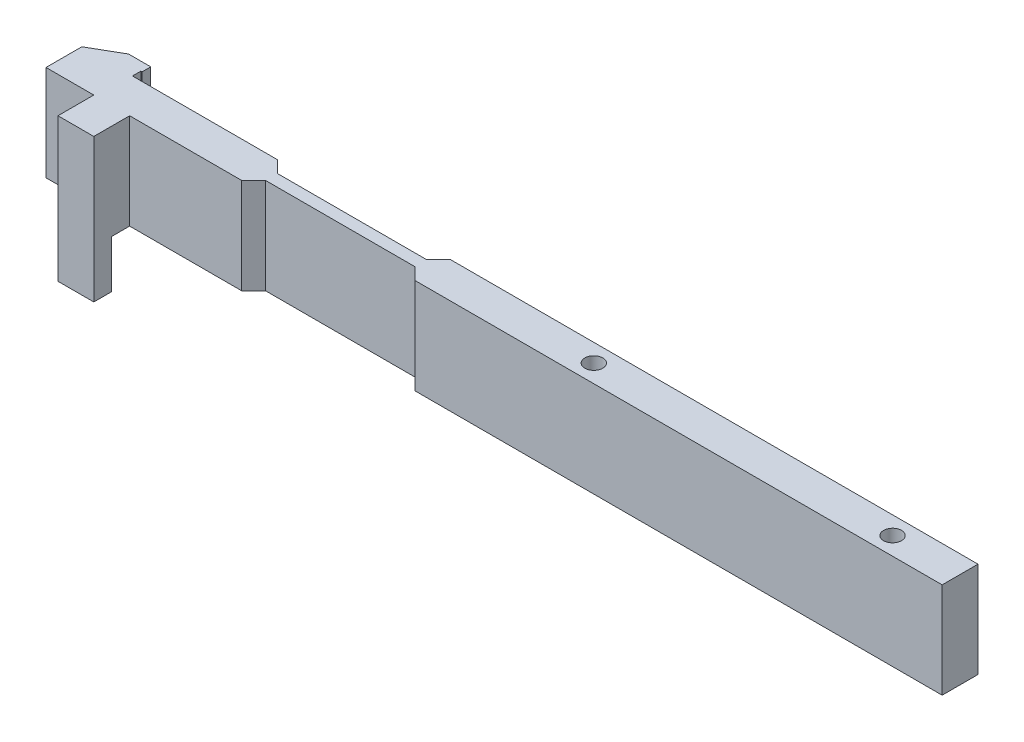
ISO-10303-21;
HEADER;
FILE_DESCRIPTION(('STEP AP214'),'2;1');
FILE_NAME('part.step','',(''),(''),'','','');
FILE_SCHEMA(('AUTOMOTIVE_DESIGN { 1 0 10303 214 1 1 1 1 }'));
ENDSEC;
DATA;
#1=APPLICATION_CONTEXT('core data for automotive mechanical design processes');
#2=APPLICATION_PROTOCOL_DEFINITION('international standard','automotive_design',2000,#1);
#3=PRODUCT_CONTEXT('',#1,'mechanical');
#4=PRODUCT('Part','Part','',(#3));
#5=PRODUCT_RELATED_PRODUCT_CATEGORY('part','',(#4));
#6=PRODUCT_DEFINITION_FORMATION('','',#4);
#7=PRODUCT_DEFINITION_CONTEXT('part definition',#1,'design');
#8=PRODUCT_DEFINITION('design','',#6,#7);
#9=PRODUCT_DEFINITION_SHAPE('','',#8);
#10=(LENGTH_UNIT() NAMED_UNIT(*) SI_UNIT(.MILLI.,.METRE.));
#11=(NAMED_UNIT(*) PLANE_ANGLE_UNIT() SI_UNIT($,.RADIAN.));
#12=(NAMED_UNIT(*) SI_UNIT($,.STERADIAN.) SOLID_ANGLE_UNIT());
#13=UNCERTAINTY_MEASURE_WITH_UNIT(LENGTH_MEASURE(1.E-05),#10,'distance_accuracy_value','');
#14=(GEOMETRIC_REPRESENTATION_CONTEXT(3) GLOBAL_UNCERTAINTY_ASSIGNED_CONTEXT((#13)) GLOBAL_UNIT_ASSIGNED_CONTEXT((#10,
#11,#12)) REPRESENTATION_CONTEXT('',''));
#15=CARTESIAN_POINT('',(0.,0.,0.));
#16=DIRECTION('',(0.,0.,1.));
#17=DIRECTION('',(1.,0.,0.));
#18=AXIS2_PLACEMENT_3D('',#15,#16,#17);
#19=CARTESIAN_POINT('',(-80.,16.,6.));
#20=DIRECTION('',(0.,0.,-1.));
#21=DIRECTION('',(-1.,0.,0.));
#22=AXIS2_PLACEMENT_3D('',#19,#20,#21);
#23=PLANE('',#22);
#24=DIRECTION('',(1.,0.,0.));
#25=VECTOR('',#24,1.);
#26=CARTESIAN_POINT('',(-80.,16.,6.));
#27=LINE('',#26,#25);
#28=CARTESIAN_POINT('',(-66.,16.,6.));
#29=VERTEX_POINT('',#28);
#30=CARTESIAN_POINT('',(-47.2356614630942,16.,6.));
#31=VERTEX_POINT('',#30);
#32=EDGE_CURVE('E67',#29,#31,#27,.T.);
#33=ORIENTED_EDGE('',*,*,#32,.F.);
#34=DIRECTION('',(0.,-1.,0.));
#35=VECTOR('',#34,1.);
#36=CARTESIAN_POINT('',(-66.,24.4852813742386,6.));
#37=LINE('',#36,#35);
#38=CARTESIAN_POINT('',(-66.,0.,6.));
#39=VERTEX_POINT('',#38);
#40=EDGE_CURVE('E240',#29,#39,#37,.T.);
#41=ORIENTED_EDGE('',*,*,#40,.T.);
#42=DIRECTION('',(1.,0.,0.));
#43=VECTOR('',#42,1.);
#44=CARTESIAN_POINT('',(-80.,0.,6.));
#45=LINE('',#44,#43);
#46=CARTESIAN_POINT('',(-47.2356614630942,0.,6.));
#47=VERTEX_POINT('',#46);
#48=EDGE_CURVE('E359',#39,#47,#45,.T.);
#49=ORIENTED_EDGE('',*,*,#48,.T.);
#50=DIRECTION('',(0.,1.,0.));
#51=VECTOR('',#50,1.);
#52=CARTESIAN_POINT('',(-47.2356614630942,16.,6.));
#53=LINE('',#52,#51);
#54=EDGE_CURVE('E313',#47,#31,#53,.T.);
#55=ORIENTED_EDGE('',*,*,#54,.T.);
#56=EDGE_LOOP('',(#33,#41,#49,#55));
#57=FACE_BOUND('',#56,.T.);
#58=ADVANCED_FACE('F43',(#57),#23,.F.);
#59=CARTESIAN_POINT('',(0.,16.,0.));
#60=DIRECTION('',(0.,0.,1.));
#61=DIRECTION('',(1.,0.,0.));
#62=AXIS2_PLACEMENT_3D('',#59,#60,#61);
#63=PLANE('',#62);
#64=DIRECTION('',(-1.,0.,0.));
#65=VECTOR('',#64,1.);
#66=CARTESIAN_POINT('',(0.,0.,0.));
#67=LINE('',#66,#65);
#68=CARTESIAN_POINT('',(70.,0.,0.));
#69=VERTEX_POINT('',#68);
#70=CARTESIAN_POINT('',(-18.2666258583228,0.,0.));
#71=VERTEX_POINT('',#70);
#72=EDGE_CURVE('E339',#69,#71,#67,.T.);
#73=ORIENTED_EDGE('',*,*,#72,.T.);
#74=DIRECTION('',(0.,1.,0.));
#75=VECTOR('',#74,1.);
#76=CARTESIAN_POINT('',(-18.2666258583228,0.,0.));
#77=LINE('',#76,#75);
#78=CARTESIAN_POINT('',(-18.2666258583228,16.,0.));
#79=VERTEX_POINT('',#78);
#80=EDGE_CURVE('E262',#71,#79,#77,.T.);
#81=ORIENTED_EDGE('',*,*,#80,.T.);
#82=DIRECTION('',(-1.,0.,0.));
#83=VECTOR('',#82,1.);
#84=CARTESIAN_POINT('',(70.,16.,0.));
#85=LINE('',#84,#83);
#86=CARTESIAN_POINT('',(70.,16.,0.));
#87=VERTEX_POINT('',#86);
#88=EDGE_CURVE('E316',#87,#79,#85,.T.);
#89=ORIENTED_EDGE('',*,*,#88,.F.);
#90=DIRECTION('',(0.,-1.,0.));
#91=VECTOR('',#90,1.);
#92=CARTESIAN_POINT('',(70.,16.,0.));
#93=LINE('',#92,#91);
#94=EDGE_CURVE('E338',#87,#69,#93,.T.);
#95=ORIENTED_EDGE('',*,*,#94,.T.);
#96=EDGE_LOOP('',(#73,#81,#89,#95));
#97=FACE_BOUND('',#96,.T.);
#98=ADVANCED_FACE('F425',(#97),#63,.F.);
#99=CARTESIAN_POINT('',(-80.,0.,6.));
#100=VERTEX_POINT('',#99);
#101=CARTESIAN_POINT('',(-72.,0.,6.));
#102=VERTEX_POINT('',#101);
#103=EDGE_CURVE('E355',#100,#102,#45,.T.);
#104=ORIENTED_EDGE('',*,*,#103,.T.);
#105=DIRECTION('',(0.,-1.,0.));
#106=VECTOR('',#105,1.);
#107=CARTESIAN_POINT('',(-72.,24.4852813742386,6.));
#108=LINE('',#107,#106);
#109=CARTESIAN_POINT('',(-72.,16.,6.));
#110=VERTEX_POINT('',#109);
#111=EDGE_CURVE('E244',#110,#102,#108,.T.);
#112=ORIENTED_EDGE('',*,*,#111,.F.);
#113=CARTESIAN_POINT('',(-80.,16.,6.));
#114=VERTEX_POINT('',#113);
#115=EDGE_CURVE('E333',#114,#110,#27,.T.);
#116=ORIENTED_EDGE('',*,*,#115,.F.);
#117=DIRECTION('',(0.,-1.,0.));
#118=VECTOR('',#117,1.);
#119=CARTESIAN_POINT('',(-80.,16.,6.));
#120=LINE('',#119,#118);
#121=EDGE_CURVE('E367',#114,#100,#120,.T.);
#122=ORIENTED_EDGE('',*,*,#121,.T.);
#123=EDGE_LOOP('',(#104,#112,#116,#122));
#124=FACE_BOUND('',#123,.T.);
#125=ADVANCED_FACE('F470',(#124),#23,.F.);
#126=CARTESIAN_POINT('',(-47.2431924720825,16.,0.));
#127=VERTEX_POINT('',#126);
#128=CARTESIAN_POINT('',(-71.5259367209433,16.,0.));
#129=VERTEX_POINT('',#128);
#130=EDGE_CURVE('E320',#127,#129,#85,.T.);
#131=ORIENTED_EDGE('',*,*,#130,.F.);
#132=DIRECTION('',(0.,1.,0.));
#133=VECTOR('',#132,1.);
#134=CARTESIAN_POINT('',(-47.2431924720825,0.,0.));
#135=LINE('',#134,#133);
#136=CARTESIAN_POINT('',(-47.2431924720825,0.,0.));
#137=VERTEX_POINT('',#136);
#138=EDGE_CURVE('E276',#137,#127,#135,.T.);
#139=ORIENTED_EDGE('',*,*,#138,.F.);
#140=CARTESIAN_POINT('',(-71.5259367209433,0.,0.));
#141=VERTEX_POINT('',#140);
#142=EDGE_CURVE('E315',#137,#141,#67,.T.);
#143=ORIENTED_EDGE('',*,*,#142,.T.);
#144=DIRECTION('',(0.,-1.,0.));
#145=VECTOR('',#144,1.);
#146=CARTESIAN_POINT('',(-71.5259367209433,16.,0.));
#147=LINE('',#146,#145);
#148=EDGE_CURVE('E52',#129,#141,#147,.T.);
#149=ORIENTED_EDGE('',*,*,#148,.F.);
#150=EDGE_LOOP('',(#131,#139,#143,#149));
#151=FACE_BOUND('',#150,.T.);
#152=ADVANCED_FACE('F45',(#151),#63,.F.);
#153=CARTESIAN_POINT('',(-71.5259367209433,16.,0.));
#154=DIRECTION('',(-1.,0.,0.));
#155=DIRECTION('',(0.,0.,1.));
#156=AXIS2_PLACEMENT_3D('',#153,#154,#155);
#157=PLANE('',#156);
#158=DIRECTION('',(0.,0.,-1.));
#159=VECTOR('',#158,1.);
#160=CARTESIAN_POINT('',(-71.5259367209433,0.,0.));
#161=LINE('',#160,#159);
#162=CARTESIAN_POINT('',(-71.5259367209433,0.,-1.39648023141273));
#163=VERTEX_POINT('',#162);
#164=EDGE_CURVE('E342',#141,#163,#161,.T.);
#165=ORIENTED_EDGE('',*,*,#164,.T.);
#166=DIRECTION('',(0.,-1.,0.));
#167=VECTOR('',#166,1.);
#168=CARTESIAN_POINT('',(-71.5259367209433,16.,-1.39648023141273));
#169=LINE('',#168,#167);
#170=CARTESIAN_POINT('',(-71.5259367209433,16.,-1.39648023141273));
#171=VERTEX_POINT('',#170);
#172=EDGE_CURVE('E382',#171,#163,#169,.T.);
#173=ORIENTED_EDGE('',*,*,#172,.F.);
#174=DIRECTION('',(0.,0.,-1.));
#175=VECTOR('',#174,1.);
#176=CARTESIAN_POINT('',(-71.5259367209433,16.,0.));
#177=LINE('',#176,#175);
#178=EDGE_CURVE('E319',#129,#171,#177,.T.);
#179=ORIENTED_EDGE('',*,*,#178,.F.);
#180=ORIENTED_EDGE('',*,*,#148,.T.);
#181=EDGE_LOOP('',(#165,#173,#179,#180));
#182=FACE_BOUND('',#181,.T.);
#183=ADVANCED_FACE('F389',(#182),#157,.F.);
#184=CARTESIAN_POINT('',(-71.5259367209433,16.,-1.39648023141273));
#185=DIRECTION('',(0.,0.,-1.));
#186=DIRECTION('',(-1.,0.,0.));
#187=AXIS2_PLACEMENT_3D('',#184,#185,#186);
#188=PLANE('',#187);
#189=DIRECTION('',(1.,0.,0.));
#190=VECTOR('',#189,1.);
#191=CARTESIAN_POINT('',(-71.5259367209433,0.,-1.39648023141273));
#192=LINE('',#191,#190);
#193=CARTESIAN_POINT('',(-71.3259367209433,0.,-1.39648023141273));
#194=VERTEX_POINT('',#193);
#195=EDGE_CURVE('E344',#163,#194,#192,.T.);
#196=ORIENTED_EDGE('',*,*,#195,.T.);
#197=DIRECTION('',(0.,-1.,0.));
#198=VECTOR('',#197,1.);
#199=CARTESIAN_POINT('',(-71.3259367209433,16.,-1.39648023141273));
#200=LINE('',#199,#198);
#201=CARTESIAN_POINT('',(-71.3259367209433,16.,-1.39648023141273));
#202=VERTEX_POINT('',#201);
#203=EDGE_CURVE('E379',#202,#194,#200,.T.);
#204=ORIENTED_EDGE('',*,*,#203,.F.);
#205=DIRECTION('',(1.,0.,0.));
#206=VECTOR('',#205,1.);
#207=CARTESIAN_POINT('',(-71.5259367209433,16.,-1.39648023141273));
#208=LINE('',#207,#206);
#209=EDGE_CURVE('E322',#171,#202,#208,.T.);
#210=ORIENTED_EDGE('',*,*,#209,.F.);
#211=ORIENTED_EDGE('',*,*,#172,.T.);
#212=EDGE_LOOP('',(#196,#204,#210,#211));
#213=FACE_BOUND('',#212,.T.);
#214=ADVANCED_FACE('F401',(#213),#188,.F.);
#215=CARTESIAN_POINT('',(-71.3259367209433,16.,-1.39648023141273));
#216=DIRECTION('',(-1.,0.,0.));
#217=DIRECTION('',(0.,0.,1.));
#218=AXIS2_PLACEMENT_3D('',#215,#216,#217);
#219=PLANE('',#218);
#220=DIRECTION('',(0.,0.,-1.));
#221=VECTOR('',#220,1.);
#222=CARTESIAN_POINT('',(-71.3259367209433,0.,-1.39648023141273));
#223=LINE('',#222,#221);
#224=CARTESIAN_POINT('',(-71.3259367209433,0.,-2.85863640033661));
#225=VERTEX_POINT('',#224);
#226=EDGE_CURVE('E346',#194,#225,#223,.T.);
#227=ORIENTED_EDGE('',*,*,#226,.T.);
#228=DIRECTION('',(0.,-1.,0.));
#229=VECTOR('',#228,1.);
#230=CARTESIAN_POINT('',(-71.3259367209433,16.,-2.85863640033661));
#231=LINE('',#230,#229);
#232=CARTESIAN_POINT('',(-71.3259367209433,16.,-2.85863640033661));
#233=VERTEX_POINT('',#232);
#234=EDGE_CURVE('E376',#233,#225,#231,.T.);
#235=ORIENTED_EDGE('',*,*,#234,.F.);
#236=DIRECTION('',(0.,0.,-1.));
#237=VECTOR('',#236,1.);
#238=CARTESIAN_POINT('',(-71.3259367209433,16.,-1.39648023141273));
#239=LINE('',#238,#237);
#240=EDGE_CURVE('E324',#202,#233,#239,.T.);
#241=ORIENTED_EDGE('',*,*,#240,.F.);
#242=ORIENTED_EDGE('',*,*,#203,.T.);
#243=EDGE_LOOP('',(#227,#235,#241,#242));
#244=FACE_BOUND('',#243,.T.);
#245=ADVANCED_FACE('F405',(#244),#219,.F.);
#246=CARTESIAN_POINT('',(-71.3259367209433,16.,-2.85863640033661));
#247=DIRECTION('',(0.,0.,1.));
#248=DIRECTION('',(1.,0.,0.));
#249=AXIS2_PLACEMENT_3D('',#246,#247,#248);
#250=PLANE('',#249);
#251=DIRECTION('',(-1.,0.,0.));
#252=VECTOR('',#251,1.);
#253=CARTESIAN_POINT('',(-71.3259367209433,0.,-2.85863640033661));
#254=LINE('',#253,#252);
#255=CARTESIAN_POINT('',(-75.0356524240512,0.,-2.85863640033661));
#256=VERTEX_POINT('',#255);
#257=EDGE_CURVE('E348',#225,#256,#254,.T.);
#258=ORIENTED_EDGE('',*,*,#257,.T.);
#259=DIRECTION('',(0.,-1.,0.));
#260=VECTOR('',#259,1.);
#261=CARTESIAN_POINT('',(-75.0356524240512,16.,-2.85863640033661));
#262=LINE('',#261,#260);
#263=CARTESIAN_POINT('',(-75.0356524240512,16.,-2.85863640033661));
#264=VERTEX_POINT('',#263);
#265=EDGE_CURVE('E373',#264,#256,#262,.T.);
#266=ORIENTED_EDGE('',*,*,#265,.F.);
#267=DIRECTION('',(-1.,0.,0.));
#268=VECTOR('',#267,1.);
#269=CARTESIAN_POINT('',(-71.3259367209433,16.,-2.85863640033661));
#270=LINE('',#269,#268);
#271=EDGE_CURVE('E326',#233,#264,#270,.T.);
#272=ORIENTED_EDGE('',*,*,#271,.F.);
#273=ORIENTED_EDGE('',*,*,#234,.T.);
#274=EDGE_LOOP('',(#258,#266,#272,#273));
#275=FACE_BOUND('',#274,.T.);
#276=ADVANCED_FACE('F485',(#275),#250,.F.);
#277=CARTESIAN_POINT('',(-75.0356524240512,16.,-2.85863640033661));
#278=DIRECTION('',(0.5,0.,0.866025403784438));
#279=DIRECTION('',(0.866025403784439,0.,-0.5));
#280=AXIS2_PLACEMENT_3D('',#277,#278,#279);
#281=PLANE('',#280);
#282=DIRECTION('',(-0.866025403784438,0.,0.5));
#283=VECTOR('',#282,1.);
#284=CARTESIAN_POINT('',(-75.0356524240512,0.,-2.85863640033661));
#285=LINE('',#284,#283);
#286=CARTESIAN_POINT('',(-80.,0.,0.0075310089883121));
#287=VERTEX_POINT('',#286);
#288=EDGE_CURVE('E350',#256,#287,#285,.T.);
#289=ORIENTED_EDGE('',*,*,#288,.T.);
#290=DIRECTION('',(0.,-1.,0.));
#291=VECTOR('',#290,1.);
#292=CARTESIAN_POINT('',(-80.,16.,0.0075310089883121));
#293=LINE('',#292,#291);
#294=CARTESIAN_POINT('',(-80.,16.,0.0075310089883121));
#295=VERTEX_POINT('',#294);
#296=EDGE_CURVE('E370',#295,#287,#293,.T.);
#297=ORIENTED_EDGE('',*,*,#296,.F.);
#298=DIRECTION('',(-0.866025403784438,0.,0.5));
#299=VECTOR('',#298,1.);
#300=CARTESIAN_POINT('',(-75.0356524240512,16.,-2.85863640033661));
#301=LINE('',#300,#299);
#302=EDGE_CURVE('E328',#264,#295,#301,.T.);
#303=ORIENTED_EDGE('',*,*,#302,.F.);
#304=ORIENTED_EDGE('',*,*,#265,.T.);
#305=EDGE_LOOP('',(#289,#297,#303,#304));
#306=FACE_BOUND('',#305,.T.);
#307=ADVANCED_FACE('F483',(#306),#281,.F.);
#308=CARTESIAN_POINT('',(-80.,16.,0.0075310089883121));
#309=DIRECTION('',(1.,0.,0.));
#310=DIRECTION('',(0.,0.,-1.));
#311=AXIS2_PLACEMENT_3D('',#308,#309,#310);
#312=PLANE('',#311);
#313=DIRECTION('',(0.,0.,1.));
#314=VECTOR('',#313,1.);
#315=CARTESIAN_POINT('',(-80.,0.,0.0075310089883121));
#316=LINE('',#315,#314);
#317=EDGE_CURVE('E352',#287,#100,#316,.T.);
#318=ORIENTED_EDGE('',*,*,#317,.T.);
#319=ORIENTED_EDGE('',*,*,#121,.F.);
#320=DIRECTION('',(0.,0.,1.));
#321=VECTOR('',#320,1.);
#322=CARTESIAN_POINT('',(-80.,16.,0.0075310089883121));
#323=LINE('',#322,#321);
#324=EDGE_CURVE('E330',#295,#114,#323,.T.);
#325=ORIENTED_EDGE('',*,*,#324,.F.);
#326=ORIENTED_EDGE('',*,*,#296,.T.);
#327=EDGE_LOOP('',(#318,#319,#325,#326));
#328=FACE_BOUND('',#327,.T.);
#329=ADVANCED_FACE('F480',(#328),#312,.F.);
#330=CARTESIAN_POINT('',(-18.2741568673111,16.,6.));
#331=VERTEX_POINT('',#330);
#332=CARTESIAN_POINT('',(70.,16.,6.));
#333=VERTEX_POINT('',#332);
#334=EDGE_CURVE('E332',#331,#333,#27,.T.);
#335=ORIENTED_EDGE('',*,*,#334,.F.);
#336=DIRECTION('',(0.,-1.,0.));
#337=VECTOR('',#336,1.);
#338=CARTESIAN_POINT('',(-18.2741568673111,16.,6.));
#339=LINE('',#338,#337);
#340=CARTESIAN_POINT('',(-18.2741568673111,0.,6.));
#341=VERTEX_POINT('',#340);
#342=EDGE_CURVE('E307',#331,#341,#339,.T.);
#343=ORIENTED_EDGE('',*,*,#342,.T.);
#344=CARTESIAN_POINT('',(70.,0.,6.));
#345=VERTEX_POINT('',#344);
#346=EDGE_CURVE('E354',#341,#345,#45,.T.);
#347=ORIENTED_EDGE('',*,*,#346,.T.);
#348=DIRECTION('',(0.,-1.,0.));
#349=VECTOR('',#348,1.);
#350=CARTESIAN_POINT('',(70.,16.,6.));
#351=LINE('',#350,#349);
#352=EDGE_CURVE('E364',#333,#345,#351,.T.);
#353=ORIENTED_EDGE('',*,*,#352,.F.);
#354=EDGE_LOOP('',(#335,#343,#347,#353));
#355=FACE_BOUND('',#354,.T.);
#356=ADVANCED_FACE('F451',(#355),#23,.F.);
#357=CARTESIAN_POINT('',(70.,16.,6.));
#358=DIRECTION('',(-1.,0.,0.));
#359=DIRECTION('',(0.,0.,1.));
#360=AXIS2_PLACEMENT_3D('',#357,#358,#359);
#361=PLANE('',#360);
#362=DIRECTION('',(0.,0.,-1.));
#363=VECTOR('',#362,1.);
#364=CARTESIAN_POINT('',(70.,0.,6.));
#365=LINE('',#364,#363);
#366=EDGE_CURVE('E358',#345,#69,#365,.T.);
#367=ORIENTED_EDGE('',*,*,#366,.T.);
#368=ORIENTED_EDGE('',*,*,#94,.F.);
#369=DIRECTION('',(0.,0.,-1.));
#370=VECTOR('',#369,1.);
#371=CARTESIAN_POINT('',(70.,16.,6.));
#372=LINE('',#371,#370);
#373=EDGE_CURVE('E336',#333,#87,#372,.T.);
#374=ORIENTED_EDGE('',*,*,#373,.F.);
#375=ORIENTED_EDGE('',*,*,#352,.T.);
#376=EDGE_LOOP('',(#367,#368,#374,#375));
#377=FACE_BOUND('',#376,.T.);
#378=ADVANCED_FACE('F432',(#377),#361,.F.);
#379=CARTESIAN_POINT('',(0.,16.,0.));
#380=DIRECTION('',(0.,-1.,0.));
#381=DIRECTION('',(0.,0.,-1.));
#382=AXIS2_PLACEMENT_3D('',#379,#380,#381);
#383=PLANE('',#382);
#384=CARTESIAN_POINT('',(58.6991032148639,16.,3.00376550449415));
#385=DIRECTION('',(0.,1.,0.));
#386=DIRECTION('',(0.,0.,1.));
#387=AXIS2_PLACEMENT_3D('',#384,#385,#386);
#388=CIRCLE('',#387,1.5);
#389=CARTESIAN_POINT('',(58.6991032148639,16.,4.50376550449415));
#390=VERTEX_POINT('',#389);
#391=EDGE_CURVE('E251',#390,#390,#388,.T.);
#392=ORIENTED_EDGE('',*,*,#391,.F.);
#393=EDGE_LOOP('',(#392));
#394=FACE_BOUND('',#393,.T.);
#395=CARTESIAN_POINT('',(8.69910321486389,16.,3.00376550449415));
#396=DIRECTION('',(0.,1.,0.));
#397=DIRECTION('',(0.,0.,1.));
#398=AXIS2_PLACEMENT_3D('',#395,#396,#397);
#399=CIRCLE('',#398,1.5);
#400=CARTESIAN_POINT('',(8.69910321486389,16.,4.50376550449416));
#401=VERTEX_POINT('',#400);
#402=EDGE_CURVE('E273',#401,#401,#399,.T.);
#403=ORIENTED_EDGE('',*,*,#402,.F.);
#404=EDGE_LOOP('',(#403));
#405=FACE_BOUND('',#404,.T.);
#406=ORIENTED_EDGE('',*,*,#115,.T.);
#407=DIRECTION('',(0.,0.,1.));
#408=VECTOR('',#407,1.);
#409=CARTESIAN_POINT('',(-72.,16.,12.));
#410=LINE('',#409,#408);
#411=CARTESIAN_POINT('',(-72.,16.,12.));
#412=VERTEX_POINT('',#411);
#413=EDGE_CURVE('E237',#110,#412,#410,.T.);
#414=ORIENTED_EDGE('',*,*,#413,.T.);
#415=DIRECTION('',(1.,0.,0.));
#416=VECTOR('',#415,1.);
#417=CARTESIAN_POINT('',(-72.,16.,12.));
#418=LINE('',#417,#416);
#419=CARTESIAN_POINT('',(-66.,16.,12.));
#420=VERTEX_POINT('',#419);
#421=EDGE_CURVE('E241',#412,#420,#418,.T.);
#422=ORIENTED_EDGE('',*,*,#421,.T.);
#423=DIRECTION('',(0.,0.,-1.));
#424=VECTOR('',#423,1.);
#425=CARTESIAN_POINT('',(-66.,16.,12.));
#426=LINE('',#425,#424);
#427=EDGE_CURVE('E239',#420,#29,#426,.T.);
#428=ORIENTED_EDGE('',*,*,#427,.T.);
#429=ORIENTED_EDGE('',*,*,#32,.T.);
#430=DIRECTION('',(-0.707106781186558,0.,0.707106781186537));
#431=VECTOR('',#430,1.);
#432=CARTESIAN_POINT('',(-47.2431924720825,16.,6.00753100898831));
#433=LINE('',#432,#431);
#434=CARTESIAN_POINT('',(-45.2394269675883,16.,4.00376550449416));
#435=VERTEX_POINT('',#434);
#436=EDGE_CURVE('E288',#435,#31,#433,.T.);
#437=ORIENTED_EDGE('',*,*,#436,.F.);
#438=DIRECTION('',(-1.,0.,0.));
#439=VECTOR('',#438,1.);
#440=CARTESIAN_POINT('',(-45.2394269675883,16.,4.00376550449416));
#441=LINE('',#440,#439);
#442=CARTESIAN_POINT('',(-20.270391362817,16.,4.00376550449416));
#443=VERTEX_POINT('',#442);
#444=EDGE_CURVE('E284',#443,#435,#441,.T.);
#445=ORIENTED_EDGE('',*,*,#444,.F.);
#446=DIRECTION('',(-0.707106781186558,0.,-0.707106781186537));
#447=VECTOR('',#446,1.);
#448=CARTESIAN_POINT('',(-20.270391362817,16.,4.00376550449416));
#449=LINE('',#448,#447);
#450=EDGE_CURVE('E291',#331,#443,#449,.T.);
#451=ORIENTED_EDGE('',*,*,#450,.F.);
#452=ORIENTED_EDGE('',*,*,#334,.T.);
#453=ORIENTED_EDGE('',*,*,#373,.T.);
#454=ORIENTED_EDGE('',*,*,#88,.T.);
#455=DIRECTION('',(0.707106781186558,0.,-0.707106781186537));
#456=VECTOR('',#455,1.);
#457=CARTESIAN_POINT('',(-20.270391362817,16.,2.00376550449415));
#458=LINE('',#457,#456);
#459=CARTESIAN_POINT('',(-20.270391362817,16.,2.00376550449415));
#460=VERTEX_POINT('',#459);
#461=EDGE_CURVE('E263',#460,#79,#458,.T.);
#462=ORIENTED_EDGE('',*,*,#461,.F.);
#463=DIRECTION('',(1.,0.,0.));
#464=VECTOR('',#463,1.);
#465=CARTESIAN_POINT('',(-45.2394269675883,16.,2.00376550449415));
#466=LINE('',#465,#464);
#467=CARTESIAN_POINT('',(-45.2394269675883,16.,2.00376550449415));
#468=VERTEX_POINT('',#467);
#469=EDGE_CURVE('E256',#468,#460,#466,.T.);
#470=ORIENTED_EDGE('',*,*,#469,.F.);
#471=DIRECTION('',(0.707106781186558,0.,0.707106781186537));
#472=VECTOR('',#471,1.);
#473=CARTESIAN_POINT('',(-47.2431924720825,16.,0.));
#474=LINE('',#473,#472);
#475=EDGE_CURVE('E265',#127,#468,#474,.T.);
#476=ORIENTED_EDGE('',*,*,#475,.F.);
#477=ORIENTED_EDGE('',*,*,#130,.T.);
#478=ORIENTED_EDGE('',*,*,#178,.T.);
#479=ORIENTED_EDGE('',*,*,#209,.T.);
#480=ORIENTED_EDGE('',*,*,#240,.T.);
#481=ORIENTED_EDGE('',*,*,#271,.T.);
#482=ORIENTED_EDGE('',*,*,#302,.T.);
#483=ORIENTED_EDGE('',*,*,#324,.T.);
#484=EDGE_LOOP('',(#406,#414,#422,#428,#429,#437,#445,#451,#452,#453,#454,#462,#470,#476,#477,
#478,#479,#480,#481,#482,#483));
#485=FACE_BOUND('',#484,.T.);
#486=ADVANCED_FACE('F409',(#394,#405,#485),#383,.F.);
#487=CARTESIAN_POINT('',(0.,0.,0.));
#488=DIRECTION('',(0.,-1.,0.));
#489=DIRECTION('',(0.,0.,-1.));
#490=AXIS2_PLACEMENT_3D('',#487,#488,#489);
#491=PLANE('',#490);
#492=DIRECTION('',(0.707106781186549,0.,0.707106781186546));
#493=VECTOR('',#492,1.);
#494=CARTESIAN_POINT('',(-37.4999999999998,0.,37.5));
#495=LINE('',#494,#493);
#496=CARTESIAN_POINT('',(-69.,0.,6.));
#497=VERTEX_POINT('',#496);
#498=CARTESIAN_POINT('',(-66.,0.,9.));
#499=VERTEX_POINT('',#498);
#500=EDGE_CURVE('E228',#497,#499,#495,.T.);
#501=ORIENTED_EDGE('',*,*,#500,.F.);
#502=DIRECTION('',(1.,0.,0.));
#503=VECTOR('',#502,1.);
#504=CARTESIAN_POINT('',(0.,0.,6.));
#505=LINE('',#504,#503);
#506=EDGE_CURVE('E225',#102,#497,#505,.T.);
#507=ORIENTED_EDGE('',*,*,#506,.F.);
#508=ORIENTED_EDGE('',*,*,#103,.F.);
#509=ORIENTED_EDGE('',*,*,#317,.F.);
#510=ORIENTED_EDGE('',*,*,#288,.F.);
#511=ORIENTED_EDGE('',*,*,#257,.F.);
#512=ORIENTED_EDGE('',*,*,#226,.F.);
#513=ORIENTED_EDGE('',*,*,#195,.F.);
#514=ORIENTED_EDGE('',*,*,#164,.F.);
#515=ORIENTED_EDGE('',*,*,#142,.F.);
#516=DIRECTION('',(0.707106781186558,0.,0.707106781186537));
#517=VECTOR('',#516,1.);
#518=CARTESIAN_POINT('',(-47.2431924720825,0.,0.));
#519=LINE('',#518,#517);
#520=CARTESIAN_POINT('',(-45.2394269675883,0.,2.00376550449415));
#521=VERTEX_POINT('',#520);
#522=EDGE_CURVE('E255',#137,#521,#519,.T.);
#523=ORIENTED_EDGE('',*,*,#522,.T.);
#524=DIRECTION('',(1.,0.,0.));
#525=VECTOR('',#524,1.);
#526=CARTESIAN_POINT('',(-45.2394269675883,0.,2.00376550449415));
#527=LINE('',#526,#525);
#528=CARTESIAN_POINT('',(-20.270391362817,0.,2.00376550449415));
#529=VERTEX_POINT('',#528);
#530=EDGE_CURVE('E259',#521,#529,#527,.T.);
#531=ORIENTED_EDGE('',*,*,#530,.T.);
#532=DIRECTION('',(0.707106781186558,0.,-0.707106781186537));
#533=VECTOR('',#532,1.);
#534=CARTESIAN_POINT('',(-20.270391362817,0.,2.00376550449415));
#535=LINE('',#534,#533);
#536=EDGE_CURVE('E252',#529,#71,#535,.T.);
#537=ORIENTED_EDGE('',*,*,#536,.T.);
#538=ORIENTED_EDGE('',*,*,#72,.F.);
#539=ORIENTED_EDGE('',*,*,#366,.F.);
#540=ORIENTED_EDGE('',*,*,#346,.F.);
#541=DIRECTION('',(0.707106781186558,0.,0.707106781186537));
#542=VECTOR('',#541,1.);
#543=CARTESIAN_POINT('',(-12.1370784336553,0.,12.1370784336556));
#544=LINE('',#543,#542);
#545=CARTESIAN_POINT('',(-20.270391362817,0.,4.00376550449416));
#546=VERTEX_POINT('',#545);
#547=EDGE_CURVE('E11',#546,#341,#544,.T.);
#548=ORIENTED_EDGE('',*,*,#547,.F.);
#549=DIRECTION('',(-1.,0.,0.));
#550=VECTOR('',#549,1.);
#551=CARTESIAN_POINT('',(-45.2394269675883,0.,4.00376550449416));
#552=LINE('',#551,#550);
#553=CARTESIAN_POINT('',(-45.2394269675883,0.,4.00376550449416));
#554=VERTEX_POINT('',#553);
#555=EDGE_CURVE('E283',#546,#554,#552,.T.);
#556=ORIENTED_EDGE('',*,*,#555,.T.);
#557=DIRECTION('',(-0.707106781186558,0.,0.707106781186537));
#558=VECTOR('',#557,1.);
#559=CARTESIAN_POINT('',(-47.2431924720825,0.,6.00753100898831));
#560=LINE('',#559,#558);
#561=EDGE_CURVE('E280',#554,#47,#560,.T.);
#562=ORIENTED_EDGE('',*,*,#561,.T.);
#563=ORIENTED_EDGE('',*,*,#48,.F.);
#564=DIRECTION('',(0.,0.,1.));
#565=VECTOR('',#564,1.);
#566=CARTESIAN_POINT('',(-66.,0.,12.));
#567=LINE('',#566,#565);
#568=EDGE_CURVE('E59',#39,#499,#567,.T.);
#569=ORIENTED_EDGE('',*,*,#568,.T.);
#570=EDGE_LOOP('',(#501,#507,#508,#509,#510,#511,#512,#513,#514,#515,#523,#531,#537,#538,#539,
#540,#548,#556,#562,#563,#569));
#571=FACE_BOUND('',#570,.T.);
#572=CARTESIAN_POINT('',(58.6991032148639,0.,3.00376550449415));
#573=DIRECTION('',(0.,1.,0.));
#574=DIRECTION('',(0.,0.,1.));
#575=AXIS2_PLACEMENT_3D('',#572,#573,#574);
#576=CIRCLE('',#575,1.5);
#577=CARTESIAN_POINT('',(58.6991032148639,0.,4.50376550449415));
#578=VERTEX_POINT('',#577);
#579=EDGE_CURVE('E292',#578,#578,#576,.T.);
#580=ORIENTED_EDGE('',*,*,#579,.T.);
#581=EDGE_LOOP('',(#580));
#582=FACE_BOUND('',#581,.T.);
#583=CARTESIAN_POINT('',(8.69910321486389,0.,3.00376550449415));
#584=DIRECTION('',(0.,1.,0.));
#585=DIRECTION('',(0.,0.,1.));
#586=AXIS2_PLACEMENT_3D('',#583,#584,#585);
#587=CIRCLE('',#586,1.5);
#588=CARTESIAN_POINT('',(8.69910321486389,0.,4.50376550449416));
#589=VERTEX_POINT('',#588);
#590=EDGE_CURVE('E304',#589,#589,#587,.T.);
#591=ORIENTED_EDGE('',*,*,#590,.T.);
#592=EDGE_LOOP('',(#591));
#593=FACE_BOUND('',#592,.T.);
#594=ADVANCED_FACE('F395',(#571,#582,#593),#491,.T.);
#595=CARTESIAN_POINT('',(8.69910321486389,0.,3.00376550449415));
#596=DIRECTION('',(0.,1.,0.));
#597=DIRECTION('',(0.,0.,1.));
#598=AXIS2_PLACEMENT_3D('',#595,#596,#597);
#599=CYLINDRICAL_SURFACE('',#598,1.5);
#600=ORIENTED_EDGE('',*,*,#590,.F.);
#601=EDGE_LOOP('',(#600));
#602=FACE_BOUND('',#601,.T.);
#603=ORIENTED_EDGE('',*,*,#402,.T.);
#604=EDGE_LOOP('',(#603));
#605=FACE_BOUND('',#604,.T.);
#606=ADVANCED_FACE('F578',(#602,#605),#599,.F.);
#607=CARTESIAN_POINT('',(-20.270391362817,0.,2.00376550449415));
#608=DIRECTION('',(0.707106781186537,0.,0.707106781186558));
#609=DIRECTION('',(0.707106781186558,0.,-0.707106781186537));
#610=AXIS2_PLACEMENT_3D('',#607,#608,#609);
#611=PLANE('',#610);
#612=ORIENTED_EDGE('',*,*,#461,.T.);
#613=ORIENTED_EDGE('',*,*,#80,.F.);
#614=ORIENTED_EDGE('',*,*,#536,.F.);
#615=DIRECTION('',(0.,1.,0.));
#616=VECTOR('',#615,1.);
#617=CARTESIAN_POINT('',(-20.270391362817,0.,2.00376550449415));
#618=LINE('',#617,#616);
#619=EDGE_CURVE('E271',#529,#460,#618,.T.);
#620=ORIENTED_EDGE('',*,*,#619,.T.);
#621=EDGE_LOOP('',(#612,#613,#614,#620));
#622=FACE_BOUND('',#621,.T.);
#623=ADVANCED_FACE('F422',(#622),#611,.F.);
#624=CARTESIAN_POINT('',(-45.2394269675883,0.,2.00376550449415));
#625=DIRECTION('',(0.,0.,1.));
#626=DIRECTION('',(1.,0.,0.));
#627=AXIS2_PLACEMENT_3D('',#624,#625,#626);
#628=PLANE('',#627);
#629=ORIENTED_EDGE('',*,*,#469,.T.);
#630=ORIENTED_EDGE('',*,*,#619,.F.);
#631=ORIENTED_EDGE('',*,*,#530,.F.);
#632=DIRECTION('',(0.,1.,0.));
#633=VECTOR('',#632,1.);
#634=CARTESIAN_POINT('',(-45.2394269675883,0.,2.00376550449415));
#635=LINE('',#634,#633);
#636=EDGE_CURVE('E274',#521,#468,#635,.T.);
#637=ORIENTED_EDGE('',*,*,#636,.T.);
#638=EDGE_LOOP('',(#629,#630,#631,#637));
#639=FACE_BOUND('',#638,.T.);
#640=ADVANCED_FACE('F419',(#639),#628,.F.);
#641=CARTESIAN_POINT('',(-47.2431924720825,0.,0.));
#642=DIRECTION('',(-0.707106781186537,0.,0.707106781186558));
#643=DIRECTION('',(0.707106781186558,0.,0.707106781186537));
#644=AXIS2_PLACEMENT_3D('',#641,#642,#643);
#645=PLANE('',#644);
#646=ORIENTED_EDGE('',*,*,#475,.T.);
#647=ORIENTED_EDGE('',*,*,#636,.F.);
#648=ORIENTED_EDGE('',*,*,#522,.F.);
#649=ORIENTED_EDGE('',*,*,#138,.T.);
#650=EDGE_LOOP('',(#646,#647,#648,#649));
#651=FACE_BOUND('',#650,.T.);
#652=ADVANCED_FACE('F415',(#651),#645,.F.);
#653=CARTESIAN_POINT('',(-47.2431924720825,0.,6.00753100898831));
#654=DIRECTION('',(-0.707106781186537,0.,-0.707106781186558));
#655=DIRECTION('',(-0.707106781186558,0.,0.707106781186537));
#656=AXIS2_PLACEMENT_3D('',#653,#654,#655);
#657=PLANE('',#656);
#658=ORIENTED_EDGE('',*,*,#561,.F.);
#659=DIRECTION('',(0.,1.,0.));
#660=VECTOR('',#659,1.);
#661=CARTESIAN_POINT('',(-45.2394269675883,0.,4.00376550449416));
#662=LINE('',#661,#660);
#663=EDGE_CURVE('E266',#554,#435,#662,.T.);
#664=ORIENTED_EDGE('',*,*,#663,.T.);
#665=ORIENTED_EDGE('',*,*,#436,.T.);
#666=ORIENTED_EDGE('',*,*,#54,.F.);
#667=EDGE_LOOP('',(#658,#664,#665,#666));
#668=FACE_BOUND('',#667,.T.);
#669=ADVANCED_FACE('F443',(#668),#657,.F.);
#670=CARTESIAN_POINT('',(-20.270391362817,0.,4.00376550449416));
#671=DIRECTION('',(0.707106781186537,0.,-0.707106781186558));
#672=DIRECTION('',(-0.707106781186558,0.,-0.707106781186537));
#673=AXIS2_PLACEMENT_3D('',#670,#671,#672);
#674=PLANE('',#673);
#675=ORIENTED_EDGE('',*,*,#450,.T.);
#676=DIRECTION('',(0.,1.,0.));
#677=VECTOR('',#676,1.);
#678=CARTESIAN_POINT('',(-20.270391362817,0.,4.00376550449416));
#679=LINE('',#678,#677);
#680=EDGE_CURVE('E287',#546,#443,#679,.T.);
#681=ORIENTED_EDGE('',*,*,#680,.F.);
#682=ORIENTED_EDGE('',*,*,#547,.T.);
#683=ORIENTED_EDGE('',*,*,#342,.F.);
#684=EDGE_LOOP('',(#675,#681,#682,#683));
#685=FACE_BOUND('',#684,.T.);
#686=ADVANCED_FACE('F450',(#685),#674,.F.);
#687=CARTESIAN_POINT('',(-45.2394269675883,0.,4.00376550449416));
#688=DIRECTION('',(0.,0.,-1.));
#689=DIRECTION('',(-1.,0.,0.));
#690=AXIS2_PLACEMENT_3D('',#687,#688,#689);
#691=PLANE('',#690);
#692=ORIENTED_EDGE('',*,*,#444,.T.);
#693=ORIENTED_EDGE('',*,*,#663,.F.);
#694=ORIENTED_EDGE('',*,*,#555,.F.);
#695=ORIENTED_EDGE('',*,*,#680,.T.);
#696=EDGE_LOOP('',(#692,#693,#694,#695));
#697=FACE_BOUND('',#696,.T.);
#698=ADVANCED_FACE('F447',(#697),#691,.F.);
#699=CARTESIAN_POINT('',(58.6991032148639,0.,3.00376550449415));
#700=DIRECTION('',(0.,1.,0.));
#701=DIRECTION('',(0.,0.,1.));
#702=AXIS2_PLACEMENT_3D('',#699,#700,#701);
#703=CYLINDRICAL_SURFACE('',#702,1.5);
#704=ORIENTED_EDGE('',*,*,#579,.F.);
#705=EDGE_LOOP('',(#704));
#706=FACE_BOUND('',#705,.T.);
#707=ORIENTED_EDGE('',*,*,#391,.T.);
#708=EDGE_LOOP('',(#707));
#709=FACE_BOUND('',#708,.T.);
#710=ADVANCED_FACE('F619',(#706,#709),#703,.F.);
#711=CARTESIAN_POINT('',(-66.,24.4852813742386,12.));
#712=DIRECTION('',(1.,0.,0.));
#713=DIRECTION('',(0.,0.,-1.));
#714=AXIS2_PLACEMENT_3D('',#711,#712,#713);
#715=PLANE('',#714);
#716=ORIENTED_EDGE('',*,*,#427,.F.);
#717=DIRECTION('',(0.,-1.,0.));
#718=VECTOR('',#717,1.);
#719=CARTESIAN_POINT('',(-66.,24.4852813742386,12.));
#720=LINE('',#719,#718);
#721=CARTESIAN_POINT('',(-66.,-8.,12.));
#722=VERTEX_POINT('',#721);
#723=EDGE_CURVE('E211',#420,#722,#720,.T.);
#724=ORIENTED_EDGE('',*,*,#723,.T.);
#725=DIRECTION('',(0.,0.,1.));
#726=VECTOR('',#725,1.);
#727=CARTESIAN_POINT('',(-66.,-8.,0.));
#728=LINE('',#727,#726);
#729=CARTESIAN_POINT('',(-66.,-8.,9.));
#730=VERTEX_POINT('',#729);
#731=EDGE_CURVE('E203',#730,#722,#728,.T.);
#732=ORIENTED_EDGE('',*,*,#731,.F.);
#733=DIRECTION('',(0.,1.,0.));
#734=VECTOR('',#733,1.);
#735=CARTESIAN_POINT('',(-66.,-8.,9.));
#736=LINE('',#735,#734);
#737=EDGE_CURVE('E208',#730,#499,#736,.T.);
#738=ORIENTED_EDGE('',*,*,#737,.T.);
#739=ORIENTED_EDGE('',*,*,#568,.F.);
#740=ORIENTED_EDGE('',*,*,#40,.F.);
#741=EDGE_LOOP('',(#716,#724,#732,#738,#739,#740));
#742=FACE_BOUND('',#741,.T.);
#743=ADVANCED_FACE('F206',(#742),#715,.T.);
#744=CARTESIAN_POINT('',(-72.,24.4852813742386,12.));
#745=DIRECTION('',(-1.,0.,0.));
#746=DIRECTION('',(0.,0.,1.));
#747=AXIS2_PLACEMENT_3D('',#744,#745,#746);
#748=PLANE('',#747);
#749=ORIENTED_EDGE('',*,*,#413,.F.);
#750=ORIENTED_EDGE('',*,*,#111,.T.);
#751=DIRECTION('',(0.,1.,0.));
#752=VECTOR('',#751,1.);
#753=CARTESIAN_POINT('',(-72.,-8.,6.));
#754=LINE('',#753,#752);
#755=CARTESIAN_POINT('',(-72.,-8.,6.));
#756=VERTEX_POINT('',#755);
#757=EDGE_CURVE('E229',#756,#102,#754,.T.);
#758=ORIENTED_EDGE('',*,*,#757,.F.);
#759=DIRECTION('',(0.,0.,-1.));
#760=VECTOR('',#759,1.);
#761=CARTESIAN_POINT('',(-72.,-8.,0.));
#762=LINE('',#761,#760);
#763=CARTESIAN_POINT('',(-72.,-8.,12.));
#764=VERTEX_POINT('',#763);
#765=EDGE_CURVE('E457',#764,#756,#762,.T.);
#766=ORIENTED_EDGE('',*,*,#765,.F.);
#767=DIRECTION('',(0.,-1.,0.));
#768=VECTOR('',#767,1.);
#769=CARTESIAN_POINT('',(-72.,24.4852813742386,12.));
#770=LINE('',#769,#768);
#771=EDGE_CURVE('E247',#412,#764,#770,.T.);
#772=ORIENTED_EDGE('',*,*,#771,.F.);
#773=EDGE_LOOP('',(#749,#750,#758,#766,#772));
#774=FACE_BOUND('',#773,.T.);
#775=ADVANCED_FACE('F475',(#774),#748,.T.);
#776=CARTESIAN_POINT('',(-72.,24.4852813742386,12.));
#777=DIRECTION('',(0.,0.,1.));
#778=DIRECTION('',(1.,0.,0.));
#779=AXIS2_PLACEMENT_3D('',#776,#777,#778);
#780=PLANE('',#779);
#781=ORIENTED_EDGE('',*,*,#421,.F.);
#782=ORIENTED_EDGE('',*,*,#771,.T.);
#783=DIRECTION('',(-1.,0.,0.));
#784=VECTOR('',#783,1.);
#785=CARTESIAN_POINT('',(0.,-8.,12.));
#786=LINE('',#785,#784);
#787=EDGE_CURVE('E215',#722,#764,#786,.T.);
#788=ORIENTED_EDGE('',*,*,#787,.F.);
#789=ORIENTED_EDGE('',*,*,#723,.F.);
#790=EDGE_LOOP('',(#781,#782,#788,#789));
#791=FACE_BOUND('',#790,.T.);
#792=ADVANCED_FACE('F454',(#791),#780,.T.);
#793=CARTESIAN_POINT('',(-37.4999999999998,-8.,37.5));
#794=DIRECTION('',(-0.707106781186546,0.,0.707106781186549));
#795=DIRECTION('',(0.707106781186549,0.,0.707106781186546));
#796=AXIS2_PLACEMENT_3D('',#793,#794,#795);
#797=PLANE('',#796);
#798=ORIENTED_EDGE('',*,*,#500,.T.);
#799=ORIENTED_EDGE('',*,*,#737,.F.);
#800=DIRECTION('',(0.707106781186549,0.,0.707106781186546));
#801=VECTOR('',#800,1.);
#802=CARTESIAN_POINT('',(-37.4999999999998,-8.,37.5));
#803=LINE('',#802,#801);
#804=CARTESIAN_POINT('',(-69.,-8.,6.));
#805=VERTEX_POINT('',#804);
#806=EDGE_CURVE('E216',#805,#730,#803,.T.);
#807=ORIENTED_EDGE('',*,*,#806,.F.);
#808=DIRECTION('',(0.,1.,0.));
#809=VECTOR('',#808,1.);
#810=CARTESIAN_POINT('',(-69.,-8.,6.));
#811=LINE('',#810,#809);
#812=EDGE_CURVE('E233',#805,#497,#811,.T.);
#813=ORIENTED_EDGE('',*,*,#812,.T.);
#814=EDGE_LOOP('',(#798,#799,#807,#813));
#815=FACE_BOUND('',#814,.T.);
#816=ADVANCED_FACE('F227',(#815),#797,.F.);
#817=CARTESIAN_POINT('',(0.,-8.,6.));
#818=DIRECTION('',(0.,0.,1.));
#819=DIRECTION('',(1.,0.,0.));
#820=AXIS2_PLACEMENT_3D('',#817,#818,#819);
#821=PLANE('',#820);
#822=ORIENTED_EDGE('',*,*,#506,.T.);
#823=ORIENTED_EDGE('',*,*,#812,.F.);
#824=DIRECTION('',(1.,0.,0.));
#825=VECTOR('',#824,1.);
#826=CARTESIAN_POINT('',(0.,-8.,6.));
#827=LINE('',#826,#825);
#828=EDGE_CURVE('E221',#756,#805,#827,.T.);
#829=ORIENTED_EDGE('',*,*,#828,.F.);
#830=ORIENTED_EDGE('',*,*,#757,.T.);
#831=EDGE_LOOP('',(#822,#823,#829,#830));
#832=FACE_BOUND('',#831,.T.);
#833=ADVANCED_FACE('F465',(#832),#821,.F.);
#834=CARTESIAN_POINT('',(0.,-8.,0.));
#835=DIRECTION('',(0.,-1.,0.));
#836=DIRECTION('',(0.,0.,-1.));
#837=AXIS2_PLACEMENT_3D('',#834,#835,#836);
#838=PLANE('',#837);
#839=ORIENTED_EDGE('',*,*,#806,.T.);
#840=ORIENTED_EDGE('',*,*,#731,.T.);
#841=ORIENTED_EDGE('',*,*,#787,.T.);
#842=ORIENTED_EDGE('',*,*,#765,.T.);
#843=ORIENTED_EDGE('',*,*,#828,.T.);
#844=EDGE_LOOP('',(#839,#840,#841,#842,#843));
#845=FACE_BOUND('',#844,.T.);
#846=ADVANCED_FACE('F219',(#845),#838,.T.);
#847=CLOSED_SHELL('',(#58,#98,#125,#152,#183,#214,#245,#276,#307,#329,#356,#378,#486,#594,#606,
#623,#640,#652,#669,#686,#698,#710,#743,#775,#792,#816,#833,#846));
#848=MANIFOLD_SOLID_BREP('B2',#847);
#849=ADVANCED_BREP_SHAPE_REPRESENTATION('',(#18,#848),#14);
#850=SHAPE_DEFINITION_REPRESENTATION(#9,#849);
ENDSEC;
END-ISO-10303-21;
